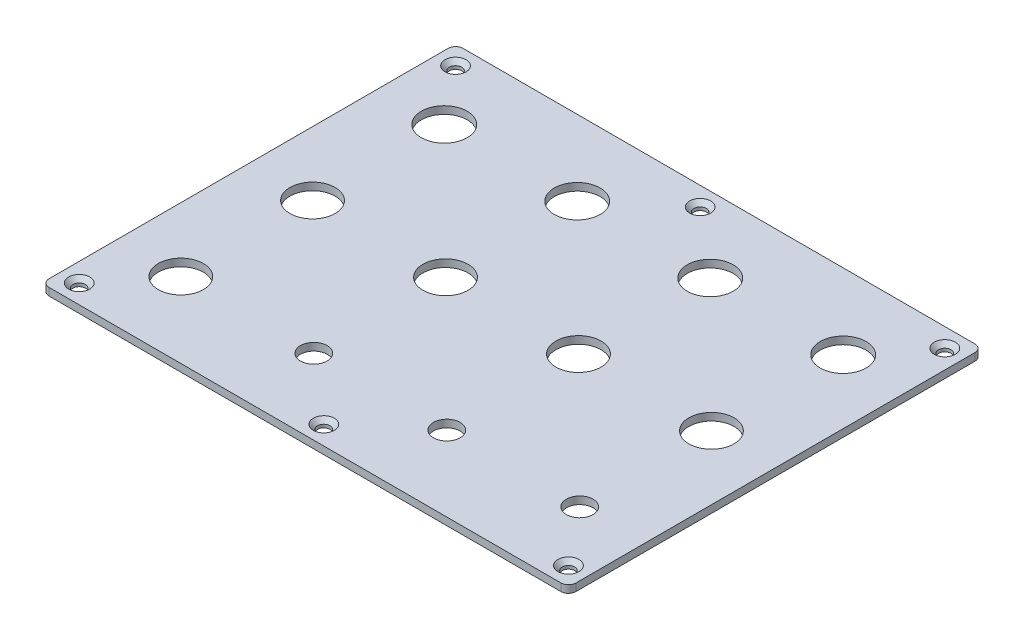
ISO-10303-21;
HEADER;
FILE_DESCRIPTION(('STEP AP214'),'2;1');
FILE_NAME('part.step','',(''),(''),'','','');
FILE_SCHEMA(('AUTOMOTIVE_DESIGN { 1 0 10303 214 1 1 1 1 }'));
ENDSEC;
DATA;
#1=APPLICATION_CONTEXT('core data for automotive mechanical design processes');
#2=APPLICATION_PROTOCOL_DEFINITION('international standard','automotive_design',2000,#1);
#3=PRODUCT_CONTEXT('',#1,'mechanical');
#4=PRODUCT('Part','Part','',(#3));
#5=PRODUCT_RELATED_PRODUCT_CATEGORY('part','',(#4));
#6=PRODUCT_DEFINITION_FORMATION('','',#4);
#7=PRODUCT_DEFINITION_CONTEXT('part definition',#1,'design');
#8=PRODUCT_DEFINITION('design','',#6,#7);
#9=PRODUCT_DEFINITION_SHAPE('','',#8);
#10=(LENGTH_UNIT() NAMED_UNIT(*) SI_UNIT(.MILLI.,.METRE.));
#11=(NAMED_UNIT(*) PLANE_ANGLE_UNIT() SI_UNIT($,.RADIAN.));
#12=(NAMED_UNIT(*) SI_UNIT($,.STERADIAN.) SOLID_ANGLE_UNIT());
#13=UNCERTAINTY_MEASURE_WITH_UNIT(LENGTH_MEASURE(1.E-05),#10,'distance_accuracy_value','');
#14=(GEOMETRIC_REPRESENTATION_CONTEXT(3) GLOBAL_UNCERTAINTY_ASSIGNED_CONTEXT((#13)) GLOBAL_UNIT_ASSIGNED_CONTEXT((#10,
#11,#12)) REPRESENTATION_CONTEXT('',''));
#15=CARTESIAN_POINT('',(0.,0.,0.));
#16=DIRECTION('',(0.,0.,1.));
#17=DIRECTION('',(1.,0.,0.));
#18=AXIS2_PLACEMENT_3D('',#15,#16,#17);
#19=CARTESIAN_POINT('',(-138.,2.,-1.99999999999999));
#20=DIRECTION('',(0.,-1.,0.));
#21=DIRECTION('',(0.,0.,-1.));
#22=AXIS2_PLACEMENT_3D('',#19,#20,#21);
#23=CYLINDRICAL_SURFACE('',#22,2.);
#24=DIRECTION('',(0.,-1.,0.));
#25=VECTOR('',#24,1.);
#26=CARTESIAN_POINT('',(-138.,2.,0.));
#27=LINE('',#26,#25);
#28=CARTESIAN_POINT('',(-138.,2.,0.));
#29=VERTEX_POINT('',#28);
#30=CARTESIAN_POINT('',(-138.,0.,0.));
#31=VERTEX_POINT('',#30);
#32=EDGE_CURVE('E174',#29,#31,#27,.T.);
#33=ORIENTED_EDGE('',*,*,#32,.F.);
#34=CARTESIAN_POINT('',(-138.,2.,-1.99999999999999));
#35=DIRECTION('',(0.,1.,0.));
#36=DIRECTION('',(0.,0.,1.));
#37=AXIS2_PLACEMENT_3D('',#34,#35,#36);
#38=CIRCLE('',#37,2.);
#39=CARTESIAN_POINT('',(-140.,2.,-1.99999999999999));
#40=VERTEX_POINT('',#39);
#41=EDGE_CURVE('E40',#40,#29,#38,.T.);
#42=ORIENTED_EDGE('',*,*,#41,.F.);
#43=DIRECTION('',(0.,-1.,0.));
#44=VECTOR('',#43,1.);
#45=CARTESIAN_POINT('',(-140.,2.,-1.99999999999999));
#46=LINE('',#45,#44);
#47=CARTESIAN_POINT('',(-140.,0.,-1.99999999999999));
#48=VERTEX_POINT('',#47);
#49=EDGE_CURVE('E177',#48,#40,#46,.F.);
#50=ORIENTED_EDGE('',*,*,#49,.F.);
#51=CARTESIAN_POINT('',(-138.,0.,-1.99999999999999));
#52=DIRECTION('',(0.,1.,0.));
#53=DIRECTION('',(0.,0.,1.));
#54=AXIS2_PLACEMENT_3D('',#51,#52,#53);
#55=CIRCLE('',#54,2.);
#56=EDGE_CURVE('E11',#31,#48,#55,.F.);
#57=ORIENTED_EDGE('',*,*,#56,.F.);
#58=EDGE_LOOP('',(#33,#42,#50,#57));
#59=FACE_BOUND('',#58,.T.);
#60=ADVANCED_FACE('F33',(#59),#23,.T.);
#61=CARTESIAN_POINT('',(-2.,2.,-2.));
#62=DIRECTION('',(0.,-1.,0.));
#63=DIRECTION('',(0.,0.,-1.));
#64=AXIS2_PLACEMENT_3D('',#61,#62,#63);
#65=CYLINDRICAL_SURFACE('',#64,2.);
#66=DIRECTION('',(0.,-1.,0.));
#67=VECTOR('',#66,1.);
#68=CARTESIAN_POINT('',(0.,2.,-2.));
#69=LINE('',#68,#67);
#70=CARTESIAN_POINT('',(0.,2.,-2.));
#71=VERTEX_POINT('',#70);
#72=CARTESIAN_POINT('',(0.,0.,-2.));
#73=VERTEX_POINT('',#72);
#74=EDGE_CURVE('E163',#71,#73,#69,.T.);
#75=ORIENTED_EDGE('',*,*,#74,.F.);
#76=CARTESIAN_POINT('',(-2.,2.,-2.));
#77=DIRECTION('',(0.,1.,0.));
#78=DIRECTION('',(0.,0.,1.));
#79=AXIS2_PLACEMENT_3D('',#76,#77,#78);
#80=CIRCLE('',#79,2.);
#81=CARTESIAN_POINT('',(-2.,2.,0.));
#82=VERTEX_POINT('',#81);
#83=EDGE_CURVE('E169',#82,#71,#80,.T.);
#84=ORIENTED_EDGE('',*,*,#83,.F.);
#85=DIRECTION('',(0.,-1.,0.));
#86=VECTOR('',#85,1.);
#87=CARTESIAN_POINT('',(-2.,2.,0.));
#88=LINE('',#87,#86);
#89=CARTESIAN_POINT('',(-2.,0.,0.));
#90=VERTEX_POINT('',#89);
#91=EDGE_CURVE('E166',#90,#82,#88,.F.);
#92=ORIENTED_EDGE('',*,*,#91,.F.);
#93=CARTESIAN_POINT('',(-2.,0.,-2.));
#94=DIRECTION('',(0.,1.,0.));
#95=DIRECTION('',(0.,0.,1.));
#96=AXIS2_PLACEMENT_3D('',#93,#94,#95);
#97=CIRCLE('',#96,2.);
#98=EDGE_CURVE('E171',#73,#90,#97,.F.);
#99=ORIENTED_EDGE('',*,*,#98,.F.);
#100=EDGE_LOOP('',(#75,#84,#92,#99));
#101=FACE_BOUND('',#100,.T.);
#102=ADVANCED_FACE('F216',(#101),#65,.T.);
#103=CARTESIAN_POINT('',(-2.,2.,-108.));
#104=DIRECTION('',(0.,-1.,0.));
#105=DIRECTION('',(0.,0.,-1.));
#106=AXIS2_PLACEMENT_3D('',#103,#104,#105);
#107=CYLINDRICAL_SURFACE('',#106,2.);
#108=DIRECTION('',(0.,-1.,0.));
#109=VECTOR('',#108,1.);
#110=CARTESIAN_POINT('',(-2.,2.,-110.));
#111=LINE('',#110,#109);
#112=CARTESIAN_POINT('',(-2.,2.,-110.));
#113=VERTEX_POINT('',#112);
#114=CARTESIAN_POINT('',(-2.,0.,-110.));
#115=VERTEX_POINT('',#114);
#116=EDGE_CURVE('E105',#113,#115,#111,.T.);
#117=ORIENTED_EDGE('',*,*,#116,.F.);
#118=CARTESIAN_POINT('',(-2.,2.,-108.));
#119=DIRECTION('',(0.,1.,0.));
#120=DIRECTION('',(0.,0.,1.));
#121=AXIS2_PLACEMENT_3D('',#118,#119,#120);
#122=CIRCLE('',#121,2.);
#123=CARTESIAN_POINT('',(0.,2.,-108.));
#124=VERTEX_POINT('',#123);
#125=EDGE_CURVE('E158',#124,#113,#122,.T.);
#126=ORIENTED_EDGE('',*,*,#125,.F.);
#127=DIRECTION('',(0.,-1.,0.));
#128=VECTOR('',#127,1.);
#129=CARTESIAN_POINT('',(0.,2.,-108.));
#130=LINE('',#129,#128);
#131=CARTESIAN_POINT('',(0.,0.,-108.));
#132=VERTEX_POINT('',#131);
#133=EDGE_CURVE('E155',#132,#124,#130,.F.);
#134=ORIENTED_EDGE('',*,*,#133,.F.);
#135=CARTESIAN_POINT('',(-2.,0.,-108.));
#136=DIRECTION('',(0.,1.,0.));
#137=DIRECTION('',(0.,0.,1.));
#138=AXIS2_PLACEMENT_3D('',#135,#136,#137);
#139=CIRCLE('',#138,2.);
#140=EDGE_CURVE('E160',#115,#132,#139,.F.);
#141=ORIENTED_EDGE('',*,*,#140,.F.);
#142=EDGE_LOOP('',(#117,#126,#134,#141));
#143=FACE_BOUND('',#142,.T.);
#144=ADVANCED_FACE('F211',(#143),#107,.T.);
#145=CARTESIAN_POINT('',(-138.,2.,-108.));
#146=DIRECTION('',(0.,-1.,0.));
#147=DIRECTION('',(0.,0.,-1.));
#148=AXIS2_PLACEMENT_3D('',#145,#146,#147);
#149=CYLINDRICAL_SURFACE('',#148,2.);
#150=DIRECTION('',(0.,-1.,0.));
#151=VECTOR('',#150,1.);
#152=CARTESIAN_POINT('',(-140.,2.,-108.));
#153=LINE('',#152,#151);
#154=CARTESIAN_POINT('',(-140.,2.,-108.));
#155=VERTEX_POINT('',#154);
#156=CARTESIAN_POINT('',(-140.,0.,-108.));
#157=VERTEX_POINT('',#156);
#158=EDGE_CURVE('E100',#155,#157,#153,.T.);
#159=ORIENTED_EDGE('',*,*,#158,.F.);
#160=CARTESIAN_POINT('',(-138.,2.,-108.));
#161=DIRECTION('',(0.,1.,0.));
#162=DIRECTION('',(0.,0.,1.));
#163=AXIS2_PLACEMENT_3D('',#160,#161,#162);
#164=CIRCLE('',#163,2.);
#165=CARTESIAN_POINT('',(-138.,2.,-110.));
#166=VERTEX_POINT('',#165);
#167=EDGE_CURVE('E106',#166,#155,#164,.T.);
#168=ORIENTED_EDGE('',*,*,#167,.F.);
#169=DIRECTION('',(0.,-1.,0.));
#170=VECTOR('',#169,1.);
#171=CARTESIAN_POINT('',(-138.,2.,-110.));
#172=LINE('',#171,#170);
#173=CARTESIAN_POINT('',(-138.,0.,-110.));
#174=VERTEX_POINT('',#173);
#175=EDGE_CURVE('E103',#174,#166,#172,.F.);
#176=ORIENTED_EDGE('',*,*,#175,.F.);
#177=CARTESIAN_POINT('',(-138.,0.,-108.));
#178=DIRECTION('',(0.,1.,0.));
#179=DIRECTION('',(0.,0.,1.));
#180=AXIS2_PLACEMENT_3D('',#177,#178,#179);
#181=CIRCLE('',#180,2.);
#182=EDGE_CURVE('E96',#157,#174,#181,.F.);
#183=ORIENTED_EDGE('',*,*,#182,.F.);
#184=EDGE_LOOP('',(#159,#168,#176,#183));
#185=FACE_BOUND('',#184,.T.);
#186=ADVANCED_FACE('F98',(#185),#149,.T.);
#187=CARTESIAN_POINT('',(0.,2.,0.));
#188=DIRECTION('',(-1.,0.,0.));
#189=DIRECTION('',(0.,0.,1.));
#190=AXIS2_PLACEMENT_3D('',#187,#188,#189);
#191=PLANE('',#190);
#192=DIRECTION('',(0.,0.,-1.));
#193=VECTOR('',#192,1.);
#194=CARTESIAN_POINT('',(0.,2.,0.));
#195=LINE('',#194,#193);
#196=EDGE_CURVE('E120',#71,#124,#195,.T.);
#197=ORIENTED_EDGE('',*,*,#196,.F.);
#198=ORIENTED_EDGE('',*,*,#74,.T.);
#199=DIRECTION('',(0.,0.,-1.));
#200=VECTOR('',#199,1.);
#201=CARTESIAN_POINT('',(0.,0.,0.));
#202=LINE('',#201,#200);
#203=EDGE_CURVE('E122',#73,#132,#202,.T.);
#204=ORIENTED_EDGE('',*,*,#203,.T.);
#205=ORIENTED_EDGE('',*,*,#133,.T.);
#206=EDGE_LOOP('',(#197,#198,#204,#205));
#207=FACE_BOUND('',#206,.T.);
#208=ADVANCED_FACE('F213',(#207),#191,.F.);
#209=CARTESIAN_POINT('',(0.,2.,-110.));
#210=DIRECTION('',(0.,0.,1.));
#211=DIRECTION('',(1.,0.,0.));
#212=AXIS2_PLACEMENT_3D('',#209,#210,#211);
#213=PLANE('',#212);
#214=DIRECTION('',(-1.,0.,0.));
#215=VECTOR('',#214,1.);
#216=CARTESIAN_POINT('',(0.,2.,-110.));
#217=LINE('',#216,#215);
#218=EDGE_CURVE('E186',#113,#166,#217,.T.);
#219=ORIENTED_EDGE('',*,*,#218,.F.);
#220=ORIENTED_EDGE('',*,*,#116,.T.);
#221=DIRECTION('',(-1.,0.,0.));
#222=VECTOR('',#221,1.);
#223=CARTESIAN_POINT('',(0.,0.,-110.));
#224=LINE('',#223,#222);
#225=EDGE_CURVE('E118',#115,#174,#224,.T.);
#226=ORIENTED_EDGE('',*,*,#225,.T.);
#227=ORIENTED_EDGE('',*,*,#175,.T.);
#228=EDGE_LOOP('',(#219,#220,#226,#227));
#229=FACE_BOUND('',#228,.T.);
#230=ADVANCED_FACE('F208',(#229),#213,.F.);
#231=CARTESIAN_POINT('',(-140.,2.,0.));
#232=DIRECTION('',(1.,0.,0.));
#233=DIRECTION('',(0.,0.,-1.));
#234=AXIS2_PLACEMENT_3D('',#231,#232,#233);
#235=PLANE('',#234);
#236=DIRECTION('',(0.,0.,1.));
#237=VECTOR('',#236,1.);
#238=CARTESIAN_POINT('',(-140.,0.,0.));
#239=LINE('',#238,#237);
#240=EDGE_CURVE('E111',#157,#48,#239,.T.);
#241=ORIENTED_EDGE('',*,*,#240,.T.);
#242=ORIENTED_EDGE('',*,*,#49,.T.);
#243=DIRECTION('',(0.,0.,1.));
#244=VECTOR('',#243,1.);
#245=CARTESIAN_POINT('',(-140.,2.,0.));
#246=LINE('',#245,#244);
#247=EDGE_CURVE('E113',#155,#40,#246,.T.);
#248=ORIENTED_EDGE('',*,*,#247,.F.);
#249=ORIENTED_EDGE('',*,*,#158,.T.);
#250=EDGE_LOOP('',(#241,#242,#248,#249));
#251=FACE_BOUND('',#250,.T.);
#252=ADVANCED_FACE('F110',(#251),#235,.F.);
#253=CARTESIAN_POINT('',(0.,2.,0.));
#254=DIRECTION('',(0.,0.,-1.));
#255=DIRECTION('',(-1.,0.,0.));
#256=AXIS2_PLACEMENT_3D('',#253,#254,#255);
#257=PLANE('',#256);
#258=DIRECTION('',(1.,0.,0.));
#259=VECTOR('',#258,1.);
#260=CARTESIAN_POINT('',(0.,2.,0.));
#261=LINE('',#260,#259);
#262=EDGE_CURVE('E114',#29,#82,#261,.T.);
#263=ORIENTED_EDGE('',*,*,#262,.F.);
#264=ORIENTED_EDGE('',*,*,#32,.T.);
#265=DIRECTION('',(1.,0.,0.));
#266=VECTOR('',#265,1.);
#267=CARTESIAN_POINT('',(0.,0.,0.));
#268=LINE('',#267,#266);
#269=EDGE_CURVE('E117',#31,#90,#268,.T.);
#270=ORIENTED_EDGE('',*,*,#269,.T.);
#271=ORIENTED_EDGE('',*,*,#91,.T.);
#272=EDGE_LOOP('',(#263,#264,#270,#271));
#273=FACE_BOUND('',#272,.T.);
#274=ADVANCED_FACE('F183',(#273),#257,.F.);
#275=CARTESIAN_POINT('',(0.,2.,0.));
#276=DIRECTION('',(0.,1.,0.));
#277=DIRECTION('',(0.,0.,1.));
#278=AXIS2_PLACEMENT_3D('',#275,#276,#277);
#279=PLANE('',#278);
#280=CARTESIAN_POINT('',(-70.,2.,-5.));
#281=DIRECTION('',(0.,1.,0.));
#282=DIRECTION('',(0.,0.,-1.));
#283=AXIS2_PLACEMENT_3D('',#280,#281,#282);
#284=CIRCLE('',#283,2.79999999999999);
#285=CARTESIAN_POINT('',(-70.,2.,-7.8));
#286=VERTEX_POINT('',#285);
#287=EDGE_CURVE('E149',#286,#286,#284,.T.);
#288=ORIENTED_EDGE('',*,*,#287,.F.);
#289=EDGE_LOOP('',(#288));
#290=FACE_BOUND('',#289,.T.);
#291=CARTESIAN_POINT('',(-70.,2.,-105.));
#292=DIRECTION('',(0.,1.,0.));
#293=DIRECTION('',(0.,0.,1.));
#294=AXIS2_PLACEMENT_3D('',#291,#292,#293);
#295=CIRCLE('',#294,2.79999999999999);
#296=CARTESIAN_POINT('',(-70.,2.,-102.2));
#297=VERTEX_POINT('',#296);
#298=EDGE_CURVE('E146',#297,#297,#295,.T.);
#299=ORIENTED_EDGE('',*,*,#298,.F.);
#300=EDGE_LOOP('',(#299));
#301=FACE_BOUND('',#300,.T.);
#302=CARTESIAN_POINT('',(-135.,2.,-4.99999999999999));
#303=DIRECTION('',(0.,1.,0.));
#304=DIRECTION('',(0.,0.,1.));
#305=AXIS2_PLACEMENT_3D('',#302,#303,#304);
#306=CIRCLE('',#305,2.80000000000001);
#307=CARTESIAN_POINT('',(-135.,2.,-2.19999999999999));
#308=VERTEX_POINT('',#307);
#309=EDGE_CURVE('E142',#308,#308,#306,.T.);
#310=ORIENTED_EDGE('',*,*,#309,.F.);
#311=EDGE_LOOP('',(#310));
#312=FACE_BOUND('',#311,.T.);
#313=CARTESIAN_POINT('',(-5.,2.,-4.99999999999999));
#314=DIRECTION('',(0.,1.,0.));
#315=DIRECTION('',(0.,0.,1.));
#316=AXIS2_PLACEMENT_3D('',#313,#314,#315);
#317=CIRCLE('',#316,2.8);
#318=CARTESIAN_POINT('',(-5.,2.,-2.19999999999999));
#319=VERTEX_POINT('',#318);
#320=EDGE_CURVE('E138',#319,#319,#317,.T.);
#321=ORIENTED_EDGE('',*,*,#320,.F.);
#322=EDGE_LOOP('',(#321));
#323=FACE_BOUND('',#322,.T.);
#324=CARTESIAN_POINT('',(-5.,2.,-105.));
#325=DIRECTION('',(0.,1.,0.));
#326=DIRECTION('',(0.,0.,1.));
#327=AXIS2_PLACEMENT_3D('',#324,#325,#326);
#328=CIRCLE('',#327,2.79999999999999);
#329=CARTESIAN_POINT('',(-5.,2.,-102.2));
#330=VERTEX_POINT('',#329);
#331=EDGE_CURVE('E134',#330,#330,#328,.T.);
#332=ORIENTED_EDGE('',*,*,#331,.F.);
#333=EDGE_LOOP('',(#332));
#334=FACE_BOUND('',#333,.T.);
#335=CARTESIAN_POINT('',(-135.,2.,-105.));
#336=DIRECTION('',(0.,1.,0.));
#337=DIRECTION('',(0.,0.,1.));
#338=AXIS2_PLACEMENT_3D('',#335,#336,#337);
#339=CIRCLE('',#338,2.8);
#340=CARTESIAN_POINT('',(-135.,2.,-102.2));
#341=VERTEX_POINT('',#340);
#342=EDGE_CURVE('E130',#341,#341,#339,.T.);
#343=ORIENTED_EDGE('',*,*,#342,.F.);
#344=EDGE_LOOP('',(#343));
#345=FACE_BOUND('',#344,.T.);
#346=CARTESIAN_POINT('',(-123.,2.,-20.));
#347=DIRECTION('',(0.,1.,0.));
#348=DIRECTION('',(0.,0.,1.));
#349=AXIS2_PLACEMENT_3D('',#346,#347,#348);
#350=CIRCLE('',#349,6.);
#351=CARTESIAN_POINT('',(-123.,2.,-14.));
#352=VERTEX_POINT('',#351);
#353=EDGE_CURVE('E363',#352,#352,#350,.T.);
#354=ORIENTED_EDGE('',*,*,#353,.F.);
#355=EDGE_LOOP('',(#354));
#356=FACE_BOUND('',#355,.T.);
#357=CARTESIAN_POINT('',(-17.,2.,-20.));
#358=DIRECTION('',(0.,1.,0.));
#359=DIRECTION('',(0.,0.,1.));
#360=AXIS2_PLACEMENT_3D('',#357,#358,#359);
#361=CIRCLE('',#360,3.55);
#362=CARTESIAN_POINT('',(-17.,2.,-16.45));
#363=VERTEX_POINT('',#362);
#364=EDGE_CURVE('E367',#363,#363,#361,.T.);
#365=ORIENTED_EDGE('',*,*,#364,.F.);
#366=EDGE_LOOP('',(#365));
#367=FACE_BOUND('',#366,.T.);
#368=CARTESIAN_POINT('',(-52.3333333333333,2.,-20.));
#369=DIRECTION('',(0.,1.,0.));
#370=DIRECTION('',(0.,0.,1.));
#371=AXIS2_PLACEMENT_3D('',#368,#369,#370);
#372=CIRCLE('',#371,3.55);
#373=CARTESIAN_POINT('',(-52.3333333333333,2.,-16.45));
#374=VERTEX_POINT('',#373);
#375=EDGE_CURVE('E373',#374,#374,#372,.T.);
#376=ORIENTED_EDGE('',*,*,#375,.F.);
#377=EDGE_LOOP('',(#376));
#378=FACE_BOUND('',#377,.T.);
#379=CARTESIAN_POINT('',(-87.6666666666667,2.,-20.));
#380=DIRECTION('',(0.,1.,0.));
#381=DIRECTION('',(0.,0.,1.));
#382=AXIS2_PLACEMENT_3D('',#379,#380,#381);
#383=CIRCLE('',#382,3.55);
#384=CARTESIAN_POINT('',(-87.6666666666667,2.,-16.45));
#385=VERTEX_POINT('',#384);
#386=EDGE_CURVE('E379',#385,#385,#383,.T.);
#387=ORIENTED_EDGE('',*,*,#386,.F.);
#388=EDGE_LOOP('',(#387));
#389=FACE_BOUND('',#388,.T.);
#390=CARTESIAN_POINT('',(-17.,2.,-90.));
#391=DIRECTION('',(0.,1.,0.));
#392=DIRECTION('',(0.,0.,1.));
#393=AXIS2_PLACEMENT_3D('',#390,#391,#392);
#394=CIRCLE('',#393,6.09999999999999);
#395=CARTESIAN_POINT('',(-17.,2.,-83.9));
#396=VERTEX_POINT('',#395);
#397=EDGE_CURVE('E385',#396,#396,#394,.T.);
#398=ORIENTED_EDGE('',*,*,#397,.F.);
#399=EDGE_LOOP('',(#398));
#400=FACE_BOUND('',#399,.T.);
#401=CARTESIAN_POINT('',(-52.3333333333333,2.,-90.));
#402=DIRECTION('',(0.,1.,0.));
#403=DIRECTION('',(0.,0.,1.));
#404=AXIS2_PLACEMENT_3D('',#401,#402,#403);
#405=CIRCLE('',#404,6.1);
#406=CARTESIAN_POINT('',(-52.3333333333333,2.,-83.9));
#407=VERTEX_POINT('',#406);
#408=EDGE_CURVE('E391',#407,#407,#405,.T.);
#409=ORIENTED_EDGE('',*,*,#408,.F.);
#410=EDGE_LOOP('',(#409));
#411=FACE_BOUND('',#410,.T.);
#412=CARTESIAN_POINT('',(-87.6666666666667,2.,-90.));
#413=DIRECTION('',(0.,1.,0.));
#414=DIRECTION('',(0.,0.,1.));
#415=AXIS2_PLACEMENT_3D('',#412,#413,#414);
#416=CIRCLE('',#415,6.09999999999999);
#417=CARTESIAN_POINT('',(-87.6666666666667,2.,-83.9));
#418=VERTEX_POINT('',#417);
#419=EDGE_CURVE('E397',#418,#418,#416,.T.);
#420=ORIENTED_EDGE('',*,*,#419,.F.);
#421=EDGE_LOOP('',(#420));
#422=FACE_BOUND('',#421,.T.);
#423=CARTESIAN_POINT('',(-123.,2.,-90.));
#424=DIRECTION('',(0.,1.,0.));
#425=DIRECTION('',(0.,0.,1.));
#426=AXIS2_PLACEMENT_3D('',#423,#424,#425);
#427=CIRCLE('',#426,6.09999999999999);
#428=CARTESIAN_POINT('',(-123.,2.,-83.9));
#429=VERTEX_POINT('',#428);
#430=EDGE_CURVE('E403',#429,#429,#427,.T.);
#431=ORIENTED_EDGE('',*,*,#430,.F.);
#432=EDGE_LOOP('',(#431));
#433=FACE_BOUND('',#432,.T.);
#434=CARTESIAN_POINT('',(-17.,2.,-55.));
#435=DIRECTION('',(0.,1.,0.));
#436=DIRECTION('',(0.,0.,1.));
#437=AXIS2_PLACEMENT_3D('',#434,#435,#436);
#438=CIRCLE('',#437,6.00000000000001);
#439=CARTESIAN_POINT('',(-17.,2.,-49.));
#440=VERTEX_POINT('',#439);
#441=EDGE_CURVE('E409',#440,#440,#438,.T.);
#442=ORIENTED_EDGE('',*,*,#441,.F.);
#443=EDGE_LOOP('',(#442));
#444=FACE_BOUND('',#443,.T.);
#445=CARTESIAN_POINT('',(-52.3333333333333,2.,-55.));
#446=DIRECTION('',(0.,1.,0.));
#447=DIRECTION('',(0.,0.,1.));
#448=AXIS2_PLACEMENT_3D('',#445,#446,#447);
#449=CIRCLE('',#448,6.00000000000001);
#450=CARTESIAN_POINT('',(-52.3333333333333,2.,-49.));
#451=VERTEX_POINT('',#450);
#452=EDGE_CURVE('E415',#451,#451,#449,.T.);
#453=ORIENTED_EDGE('',*,*,#452,.F.);
#454=EDGE_LOOP('',(#453));
#455=FACE_BOUND('',#454,.T.);
#456=CARTESIAN_POINT('',(-87.6666666666667,2.,-55.));
#457=DIRECTION('',(0.,1.,0.));
#458=DIRECTION('',(0.,0.,1.));
#459=AXIS2_PLACEMENT_3D('',#456,#457,#458);
#460=CIRCLE('',#459,6.);
#461=CARTESIAN_POINT('',(-87.6666666666667,2.,-49.));
#462=VERTEX_POINT('',#461);
#463=EDGE_CURVE('E201',#462,#462,#460,.T.);
#464=ORIENTED_EDGE('',*,*,#463,.F.);
#465=EDGE_LOOP('',(#464));
#466=FACE_BOUND('',#465,.T.);
#467=CARTESIAN_POINT('',(-123.,2.,-55.));
#468=DIRECTION('',(0.,1.,0.));
#469=DIRECTION('',(0.,0.,1.));
#470=AXIS2_PLACEMENT_3D('',#467,#468,#469);
#471=CIRCLE('',#470,6.);
#472=CARTESIAN_POINT('',(-123.,2.,-49.));
#473=VERTEX_POINT('',#472);
#474=EDGE_CURVE('E193',#473,#473,#471,.T.);
#475=ORIENTED_EDGE('',*,*,#474,.F.);
#476=EDGE_LOOP('',(#475));
#477=FACE_BOUND('',#476,.T.);
#478=ORIENTED_EDGE('',*,*,#247,.T.);
#479=ORIENTED_EDGE('',*,*,#41,.T.);
#480=ORIENTED_EDGE('',*,*,#262,.T.);
#481=ORIENTED_EDGE('',*,*,#83,.T.);
#482=ORIENTED_EDGE('',*,*,#196,.T.);
#483=ORIENTED_EDGE('',*,*,#125,.T.);
#484=ORIENTED_EDGE('',*,*,#218,.T.);
#485=ORIENTED_EDGE('',*,*,#167,.T.);
#486=EDGE_LOOP('',(#478,#479,#480,#481,#482,#483,#484,#485));
#487=FACE_BOUND('',#486,.T.);
#488=ADVANCED_FACE('F179',(#290,#301,#312,#323,#334,#345,#356,#367,#378,#389,#400,#411,#422,
#433,#444,#455,#466,#477,#487),#279,.T.);
#489=CARTESIAN_POINT('',(0.,0.,0.));
#490=DIRECTION('',(0.,1.,0.));
#491=DIRECTION('',(0.,0.,1.));
#492=AXIS2_PLACEMENT_3D('',#489,#490,#491);
#493=PLANE('',#492);
#494=CARTESIAN_POINT('',(-70.,0.,-5.));
#495=DIRECTION('',(0.,1.,0.));
#496=DIRECTION('',(0.,0.,-1.));
#497=AXIS2_PLACEMENT_3D('',#494,#495,#496);
#498=CIRCLE('',#497,1.65);
#499=CARTESIAN_POINT('',(-70.,0.,-6.65000000000001));
#500=VERTEX_POINT('',#499);
#501=EDGE_CURVE('E129',#500,#500,#498,.T.);
#502=ORIENTED_EDGE('',*,*,#501,.T.);
#503=EDGE_LOOP('',(#502));
#504=FACE_BOUND('',#503,.T.);
#505=CARTESIAN_POINT('',(-70.,0.,-105.));
#506=DIRECTION('',(0.,1.,0.));
#507=DIRECTION('',(0.,0.,1.));
#508=AXIS2_PLACEMENT_3D('',#505,#506,#507);
#509=CIRCLE('',#508,1.65);
#510=CARTESIAN_POINT('',(-70.,0.,-103.35));
#511=VERTEX_POINT('',#510);
#512=EDGE_CURVE('E344',#511,#511,#509,.T.);
#513=ORIENTED_EDGE('',*,*,#512,.T.);
#514=EDGE_LOOP('',(#513));
#515=FACE_BOUND('',#514,.T.);
#516=CARTESIAN_POINT('',(-135.,0.,-4.99999999999999));
#517=DIRECTION('',(0.,1.,0.));
#518=DIRECTION('',(0.,0.,1.));
#519=AXIS2_PLACEMENT_3D('',#516,#517,#518);
#520=CIRCLE('',#519,1.65000000000002);
#521=CARTESIAN_POINT('',(-135.,0.,-3.34999999999997));
#522=VERTEX_POINT('',#521);
#523=EDGE_CURVE('E347',#522,#522,#520,.T.);
#524=ORIENTED_EDGE('',*,*,#523,.T.);
#525=EDGE_LOOP('',(#524));
#526=FACE_BOUND('',#525,.T.);
#527=CARTESIAN_POINT('',(-5.,0.,-4.99999999999999));
#528=DIRECTION('',(0.,1.,0.));
#529=DIRECTION('',(0.,0.,1.));
#530=AXIS2_PLACEMENT_3D('',#527,#528,#529);
#531=CIRCLE('',#530,1.65);
#532=CARTESIAN_POINT('',(-5.,0.,-3.34999999999999));
#533=VERTEX_POINT('',#532);
#534=EDGE_CURVE('E354',#533,#533,#531,.T.);
#535=ORIENTED_EDGE('',*,*,#534,.T.);
#536=EDGE_LOOP('',(#535));
#537=FACE_BOUND('',#536,.T.);
#538=CARTESIAN_POINT('',(-5.,0.,-105.));
#539=DIRECTION('',(0.,1.,0.));
#540=DIRECTION('',(0.,0.,1.));
#541=AXIS2_PLACEMENT_3D('',#538,#539,#540);
#542=CIRCLE('',#541,1.65);
#543=CARTESIAN_POINT('',(-5.,0.,-103.35));
#544=VERTEX_POINT('',#543);
#545=EDGE_CURVE('E357',#544,#544,#542,.T.);
#546=ORIENTED_EDGE('',*,*,#545,.T.);
#547=EDGE_LOOP('',(#546));
#548=FACE_BOUND('',#547,.T.);
#549=CARTESIAN_POINT('',(-135.,0.,-105.));
#550=DIRECTION('',(0.,1.,0.));
#551=DIRECTION('',(0.,0.,1.));
#552=AXIS2_PLACEMENT_3D('',#549,#550,#551);
#553=CIRCLE('',#552,1.65000000000002);
#554=CARTESIAN_POINT('',(-135.,0.,-103.35));
#555=VERTEX_POINT('',#554);
#556=EDGE_CURVE('E360',#555,#555,#553,.T.);
#557=ORIENTED_EDGE('',*,*,#556,.T.);
#558=EDGE_LOOP('',(#557));
#559=FACE_BOUND('',#558,.T.);
#560=CARTESIAN_POINT('',(-123.,0.,-20.));
#561=DIRECTION('',(0.,1.,0.));
#562=DIRECTION('',(0.,0.,1.));
#563=AXIS2_PLACEMENT_3D('',#560,#561,#562);
#564=CIRCLE('',#563,6.);
#565=CARTESIAN_POINT('',(-123.,0.,-14.));
#566=VERTEX_POINT('',#565);
#567=EDGE_CURVE('E364',#566,#566,#564,.T.);
#568=ORIENTED_EDGE('',*,*,#567,.T.);
#569=EDGE_LOOP('',(#568));
#570=FACE_BOUND('',#569,.T.);
#571=CARTESIAN_POINT('',(-17.,0.,-20.));
#572=DIRECTION('',(0.,1.,0.));
#573=DIRECTION('',(0.,0.,1.));
#574=AXIS2_PLACEMENT_3D('',#571,#572,#573);
#575=CIRCLE('',#574,3.55);
#576=CARTESIAN_POINT('',(-17.,0.,-16.45));
#577=VERTEX_POINT('',#576);
#578=EDGE_CURVE('E370',#577,#577,#575,.T.);
#579=ORIENTED_EDGE('',*,*,#578,.T.);
#580=EDGE_LOOP('',(#579));
#581=FACE_BOUND('',#580,.T.);
#582=CARTESIAN_POINT('',(-52.3333333333333,0.,-20.));
#583=DIRECTION('',(0.,1.,0.));
#584=DIRECTION('',(0.,0.,1.));
#585=AXIS2_PLACEMENT_3D('',#582,#583,#584);
#586=CIRCLE('',#585,3.55);
#587=CARTESIAN_POINT('',(-52.3333333333333,0.,-16.45));
#588=VERTEX_POINT('',#587);
#589=EDGE_CURVE('E376',#588,#588,#586,.T.);
#590=ORIENTED_EDGE('',*,*,#589,.T.);
#591=EDGE_LOOP('',(#590));
#592=FACE_BOUND('',#591,.T.);
#593=CARTESIAN_POINT('',(-87.6666666666667,0.,-20.));
#594=DIRECTION('',(0.,1.,0.));
#595=DIRECTION('',(0.,0.,1.));
#596=AXIS2_PLACEMENT_3D('',#593,#594,#595);
#597=CIRCLE('',#596,3.55);
#598=CARTESIAN_POINT('',(-87.6666666666667,0.,-16.45));
#599=VERTEX_POINT('',#598);
#600=EDGE_CURVE('E382',#599,#599,#597,.T.);
#601=ORIENTED_EDGE('',*,*,#600,.T.);
#602=EDGE_LOOP('',(#601));
#603=FACE_BOUND('',#602,.T.);
#604=CARTESIAN_POINT('',(-17.,0.,-90.));
#605=DIRECTION('',(0.,1.,0.));
#606=DIRECTION('',(0.,0.,1.));
#607=AXIS2_PLACEMENT_3D('',#604,#605,#606);
#608=CIRCLE('',#607,6.09999999999999);
#609=CARTESIAN_POINT('',(-17.,0.,-83.9));
#610=VERTEX_POINT('',#609);
#611=EDGE_CURVE('E388',#610,#610,#608,.T.);
#612=ORIENTED_EDGE('',*,*,#611,.T.);
#613=EDGE_LOOP('',(#612));
#614=FACE_BOUND('',#613,.T.);
#615=CARTESIAN_POINT('',(-52.3333333333333,0.,-90.));
#616=DIRECTION('',(0.,1.,0.));
#617=DIRECTION('',(0.,0.,1.));
#618=AXIS2_PLACEMENT_3D('',#615,#616,#617);
#619=CIRCLE('',#618,6.1);
#620=CARTESIAN_POINT('',(-52.3333333333333,0.,-83.9));
#621=VERTEX_POINT('',#620);
#622=EDGE_CURVE('E394',#621,#621,#619,.T.);
#623=ORIENTED_EDGE('',*,*,#622,.T.);
#624=EDGE_LOOP('',(#623));
#625=FACE_BOUND('',#624,.T.);
#626=CARTESIAN_POINT('',(-87.6666666666667,0.,-90.));
#627=DIRECTION('',(0.,1.,0.));
#628=DIRECTION('',(0.,0.,1.));
#629=AXIS2_PLACEMENT_3D('',#626,#627,#628);
#630=CIRCLE('',#629,6.09999999999999);
#631=CARTESIAN_POINT('',(-87.6666666666667,0.,-83.9));
#632=VERTEX_POINT('',#631);
#633=EDGE_CURVE('E400',#632,#632,#630,.T.);
#634=ORIENTED_EDGE('',*,*,#633,.T.);
#635=EDGE_LOOP('',(#634));
#636=FACE_BOUND('',#635,.T.);
#637=CARTESIAN_POINT('',(-123.,0.,-90.));
#638=DIRECTION('',(0.,1.,0.));
#639=DIRECTION('',(0.,0.,1.));
#640=AXIS2_PLACEMENT_3D('',#637,#638,#639);
#641=CIRCLE('',#640,6.09999999999999);
#642=CARTESIAN_POINT('',(-123.,0.,-83.9));
#643=VERTEX_POINT('',#642);
#644=EDGE_CURVE('E406',#643,#643,#641,.T.);
#645=ORIENTED_EDGE('',*,*,#644,.T.);
#646=EDGE_LOOP('',(#645));
#647=FACE_BOUND('',#646,.T.);
#648=CARTESIAN_POINT('',(-17.,0.,-55.));
#649=DIRECTION('',(0.,1.,0.));
#650=DIRECTION('',(0.,0.,1.));
#651=AXIS2_PLACEMENT_3D('',#648,#649,#650);
#652=CIRCLE('',#651,6.00000000000001);
#653=CARTESIAN_POINT('',(-17.,0.,-49.));
#654=VERTEX_POINT('',#653);
#655=EDGE_CURVE('E412',#654,#654,#652,.T.);
#656=ORIENTED_EDGE('',*,*,#655,.T.);
#657=EDGE_LOOP('',(#656));
#658=FACE_BOUND('',#657,.T.);
#659=CARTESIAN_POINT('',(-52.3333333333333,0.,-55.));
#660=DIRECTION('',(0.,1.,0.));
#661=DIRECTION('',(0.,0.,1.));
#662=AXIS2_PLACEMENT_3D('',#659,#660,#661);
#663=CIRCLE('',#662,6.00000000000001);
#664=CARTESIAN_POINT('',(-52.3333333333333,0.,-49.));
#665=VERTEX_POINT('',#664);
#666=EDGE_CURVE('E418',#665,#665,#663,.T.);
#667=ORIENTED_EDGE('',*,*,#666,.T.);
#668=EDGE_LOOP('',(#667));
#669=FACE_BOUND('',#668,.T.);
#670=CARTESIAN_POINT('',(-87.6666666666667,0.,-55.));
#671=DIRECTION('',(0.,1.,0.));
#672=DIRECTION('',(0.,0.,1.));
#673=AXIS2_PLACEMENT_3D('',#670,#671,#672);
#674=CIRCLE('',#673,6.);
#675=CARTESIAN_POINT('',(-87.6666666666667,0.,-49.));
#676=VERTEX_POINT('',#675);
#677=EDGE_CURVE('E198',#676,#676,#674,.T.);
#678=ORIENTED_EDGE('',*,*,#677,.T.);
#679=EDGE_LOOP('',(#678));
#680=FACE_BOUND('',#679,.T.);
#681=CARTESIAN_POINT('',(-123.,0.,-55.));
#682=DIRECTION('',(0.,1.,0.));
#683=DIRECTION('',(0.,0.,1.));
#684=AXIS2_PLACEMENT_3D('',#681,#682,#683);
#685=CIRCLE('',#684,6.);
#686=CARTESIAN_POINT('',(-123.,0.,-49.));
#687=VERTEX_POINT('',#686);
#688=EDGE_CURVE('E189',#687,#687,#685,.T.);
#689=ORIENTED_EDGE('',*,*,#688,.T.);
#690=EDGE_LOOP('',(#689));
#691=FACE_BOUND('',#690,.T.);
#692=ORIENTED_EDGE('',*,*,#269,.F.);
#693=ORIENTED_EDGE('',*,*,#56,.T.);
#694=ORIENTED_EDGE('',*,*,#240,.F.);
#695=ORIENTED_EDGE('',*,*,#182,.T.);
#696=ORIENTED_EDGE('',*,*,#225,.F.);
#697=ORIENTED_EDGE('',*,*,#140,.T.);
#698=ORIENTED_EDGE('',*,*,#203,.F.);
#699=ORIENTED_EDGE('',*,*,#98,.T.);
#700=EDGE_LOOP('',(#692,#693,#694,#695,#696,#697,#698,#699));
#701=FACE_BOUND('',#700,.T.);
#702=ADVANCED_FACE('F116',(#504,#515,#526,#537,#548,#559,#570,#581,#592,#603,#614,#625,#636,
#647,#658,#669,#680,#691,#701),#493,.F.);
#703=CARTESIAN_POINT('',(-123.,0.,-55.));
#704=DIRECTION('',(0.,1.,0.));
#705=DIRECTION('',(0.,0.,1.));
#706=AXIS2_PLACEMENT_3D('',#703,#704,#705);
#707=CYLINDRICAL_SURFACE('',#706,6.);
#708=ORIENTED_EDGE('',*,*,#688,.F.);
#709=EDGE_LOOP('',(#708));
#710=FACE_BOUND('',#709,.T.);
#711=ORIENTED_EDGE('',*,*,#474,.T.);
#712=EDGE_LOOP('',(#711));
#713=FACE_BOUND('',#712,.T.);
#714=ADVANCED_FACE('F236',(#710,#713),#707,.F.);
#715=CARTESIAN_POINT('',(-87.6666666666667,0.,-55.));
#716=DIRECTION('',(0.,1.,0.));
#717=DIRECTION('',(0.,0.,1.));
#718=AXIS2_PLACEMENT_3D('',#715,#716,#717);
#719=CYLINDRICAL_SURFACE('',#718,6.);
#720=ORIENTED_EDGE('',*,*,#677,.F.);
#721=EDGE_LOOP('',(#720));
#722=FACE_BOUND('',#721,.T.);
#723=ORIENTED_EDGE('',*,*,#463,.T.);
#724=EDGE_LOOP('',(#723));
#725=FACE_BOUND('',#724,.T.);
#726=ADVANCED_FACE('F243',(#722,#725),#719,.F.);
#727=CARTESIAN_POINT('',(-52.3333333333333,0.,-55.));
#728=DIRECTION('',(0.,1.,0.));
#729=DIRECTION('',(0.,0.,1.));
#730=AXIS2_PLACEMENT_3D('',#727,#728,#729);
#731=CYLINDRICAL_SURFACE('',#730,6.00000000000001);
#732=ORIENTED_EDGE('',*,*,#666,.F.);
#733=EDGE_LOOP('',(#732));
#734=FACE_BOUND('',#733,.T.);
#735=ORIENTED_EDGE('',*,*,#452,.T.);
#736=EDGE_LOOP('',(#735));
#737=FACE_BOUND('',#736,.T.);
#738=ADVANCED_FACE('F247',(#734,#737),#731,.F.);
#739=CARTESIAN_POINT('',(-17.,0.,-55.));
#740=DIRECTION('',(0.,1.,0.));
#741=DIRECTION('',(0.,0.,1.));
#742=AXIS2_PLACEMENT_3D('',#739,#740,#741);
#743=CYLINDRICAL_SURFACE('',#742,6.00000000000001);
#744=ORIENTED_EDGE('',*,*,#655,.F.);
#745=EDGE_LOOP('',(#744));
#746=FACE_BOUND('',#745,.T.);
#747=ORIENTED_EDGE('',*,*,#441,.T.);
#748=EDGE_LOOP('',(#747));
#749=FACE_BOUND('',#748,.T.);
#750=ADVANCED_FACE('F251',(#746,#749),#743,.F.);
#751=CARTESIAN_POINT('',(-123.,0.,-90.));
#752=DIRECTION('',(0.,1.,0.));
#753=DIRECTION('',(0.,0.,1.));
#754=AXIS2_PLACEMENT_3D('',#751,#752,#753);
#755=CYLINDRICAL_SURFACE('',#754,6.09999999999999);
#756=ORIENTED_EDGE('',*,*,#644,.F.);
#757=EDGE_LOOP('',(#756));
#758=FACE_BOUND('',#757,.T.);
#759=ORIENTED_EDGE('',*,*,#430,.T.);
#760=EDGE_LOOP('',(#759));
#761=FACE_BOUND('',#760,.T.);
#762=ADVANCED_FACE('F255',(#758,#761),#755,.F.);
#763=CARTESIAN_POINT('',(-87.6666666666667,0.,-90.));
#764=DIRECTION('',(0.,1.,0.));
#765=DIRECTION('',(0.,0.,1.));
#766=AXIS2_PLACEMENT_3D('',#763,#764,#765);
#767=CYLINDRICAL_SURFACE('',#766,6.09999999999999);
#768=ORIENTED_EDGE('',*,*,#633,.F.);
#769=EDGE_LOOP('',(#768));
#770=FACE_BOUND('',#769,.T.);
#771=ORIENTED_EDGE('',*,*,#419,.T.);
#772=EDGE_LOOP('',(#771));
#773=FACE_BOUND('',#772,.T.);
#774=ADVANCED_FACE('F259',(#770,#773),#767,.F.);
#775=CARTESIAN_POINT('',(-52.3333333333333,0.,-90.));
#776=DIRECTION('',(0.,1.,0.));
#777=DIRECTION('',(0.,0.,1.));
#778=AXIS2_PLACEMENT_3D('',#775,#776,#777);
#779=CYLINDRICAL_SURFACE('',#778,6.1);
#780=ORIENTED_EDGE('',*,*,#622,.F.);
#781=EDGE_LOOP('',(#780));
#782=FACE_BOUND('',#781,.T.);
#783=ORIENTED_EDGE('',*,*,#408,.T.);
#784=EDGE_LOOP('',(#783));
#785=FACE_BOUND('',#784,.T.);
#786=ADVANCED_FACE('F263',(#782,#785),#779,.F.);
#787=CARTESIAN_POINT('',(-17.,0.,-90.));
#788=DIRECTION('',(0.,1.,0.));
#789=DIRECTION('',(0.,0.,1.));
#790=AXIS2_PLACEMENT_3D('',#787,#788,#789);
#791=CYLINDRICAL_SURFACE('',#790,6.09999999999999);
#792=ORIENTED_EDGE('',*,*,#611,.F.);
#793=EDGE_LOOP('',(#792));
#794=FACE_BOUND('',#793,.T.);
#795=ORIENTED_EDGE('',*,*,#397,.T.);
#796=EDGE_LOOP('',(#795));
#797=FACE_BOUND('',#796,.T.);
#798=ADVANCED_FACE('F267',(#794,#797),#791,.F.);
#799=CARTESIAN_POINT('',(-87.6666666666667,0.,-20.));
#800=DIRECTION('',(0.,1.,0.));
#801=DIRECTION('',(0.,0.,1.));
#802=AXIS2_PLACEMENT_3D('',#799,#800,#801);
#803=CYLINDRICAL_SURFACE('',#802,3.55);
#804=ORIENTED_EDGE('',*,*,#600,.F.);
#805=EDGE_LOOP('',(#804));
#806=FACE_BOUND('',#805,.T.);
#807=ORIENTED_EDGE('',*,*,#386,.T.);
#808=EDGE_LOOP('',(#807));
#809=FACE_BOUND('',#808,.T.);
#810=ADVANCED_FACE('F271',(#806,#809),#803,.F.);
#811=CARTESIAN_POINT('',(-52.3333333333333,0.,-20.));
#812=DIRECTION('',(0.,1.,0.));
#813=DIRECTION('',(0.,0.,1.));
#814=AXIS2_PLACEMENT_3D('',#811,#812,#813);
#815=CYLINDRICAL_SURFACE('',#814,3.55);
#816=ORIENTED_EDGE('',*,*,#589,.F.);
#817=EDGE_LOOP('',(#816));
#818=FACE_BOUND('',#817,.T.);
#819=ORIENTED_EDGE('',*,*,#375,.T.);
#820=EDGE_LOOP('',(#819));
#821=FACE_BOUND('',#820,.T.);
#822=ADVANCED_FACE('F275',(#818,#821),#815,.F.);
#823=CARTESIAN_POINT('',(-17.,0.,-20.));
#824=DIRECTION('',(0.,1.,0.));
#825=DIRECTION('',(0.,0.,1.));
#826=AXIS2_PLACEMENT_3D('',#823,#824,#825);
#827=CYLINDRICAL_SURFACE('',#826,3.55);
#828=ORIENTED_EDGE('',*,*,#578,.F.);
#829=EDGE_LOOP('',(#828));
#830=FACE_BOUND('',#829,.T.);
#831=ORIENTED_EDGE('',*,*,#364,.T.);
#832=EDGE_LOOP('',(#831));
#833=FACE_BOUND('',#832,.T.);
#834=ADVANCED_FACE('F279',(#830,#833),#827,.F.);
#835=CARTESIAN_POINT('',(-123.,0.,-20.));
#836=DIRECTION('',(0.,1.,0.));
#837=DIRECTION('',(0.,0.,1.));
#838=AXIS2_PLACEMENT_3D('',#835,#836,#837);
#839=CYLINDRICAL_SURFACE('',#838,6.);
#840=ORIENTED_EDGE('',*,*,#567,.F.);
#841=EDGE_LOOP('',(#840));
#842=FACE_BOUND('',#841,.T.);
#843=ORIENTED_EDGE('',*,*,#353,.T.);
#844=EDGE_LOOP('',(#843));
#845=FACE_BOUND('',#844,.T.);
#846=ADVANCED_FACE('F283',(#842,#845),#839,.F.);
#847=CARTESIAN_POINT('',(-135.,0.,-105.));
#848=DIRECTION('',(0.,1.,0.));
#849=DIRECTION('',(0.,0.,1.));
#850=AXIS2_PLACEMENT_3D('',#847,#848,#849);
#851=CYLINDRICAL_SURFACE('',#850,1.65000000000002);
#852=CARTESIAN_POINT('',(-135.,0.850000000000015,-105.));
#853=DIRECTION('',(0.,1.,0.));
#854=DIRECTION('',(0.,0.,1.));
#855=AXIS2_PLACEMENT_3D('',#852,#853,#854);
#856=CIRCLE('',#855,1.65000000000002);
#857=CARTESIAN_POINT('',(-135.,0.850000000000015,-103.35));
#858=VERTEX_POINT('',#857);
#859=EDGE_CURVE('E126',#858,#858,#856,.T.);
#860=ORIENTED_EDGE('',*,*,#859,.T.);
#861=EDGE_LOOP('',(#860));
#862=FACE_BOUND('',#861,.T.);
#863=ORIENTED_EDGE('',*,*,#556,.F.);
#864=EDGE_LOOP('',(#863));
#865=FACE_BOUND('',#864,.T.);
#866=ADVANCED_FACE('F287',(#862,#865),#851,.F.);
#867=CARTESIAN_POINT('',(-5.,0.,-105.));
#868=DIRECTION('',(0.,1.,0.));
#869=DIRECTION('',(0.,0.,1.));
#870=AXIS2_PLACEMENT_3D('',#867,#868,#869);
#871=CYLINDRICAL_SURFACE('',#870,1.65);
#872=CARTESIAN_POINT('',(-5.,0.850000000000009,-105.));
#873=DIRECTION('',(0.,1.,0.));
#874=DIRECTION('',(0.,0.,1.));
#875=AXIS2_PLACEMENT_3D('',#872,#873,#874);
#876=CIRCLE('',#875,1.65);
#877=CARTESIAN_POINT('',(-5.,0.850000000000009,-103.35));
#878=VERTEX_POINT('',#877);
#879=EDGE_CURVE('E131',#878,#878,#876,.T.);
#880=ORIENTED_EDGE('',*,*,#879,.T.);
#881=EDGE_LOOP('',(#880));
#882=FACE_BOUND('',#881,.T.);
#883=ORIENTED_EDGE('',*,*,#545,.F.);
#884=EDGE_LOOP('',(#883));
#885=FACE_BOUND('',#884,.T.);
#886=ADVANCED_FACE('F291',(#882,#885),#871,.F.);
#887=CARTESIAN_POINT('',(-5.,0.,-4.99999999999999));
#888=DIRECTION('',(0.,1.,0.));
#889=DIRECTION('',(0.,0.,1.));
#890=AXIS2_PLACEMENT_3D('',#887,#888,#889);
#891=CYLINDRICAL_SURFACE('',#890,1.65);
#892=CARTESIAN_POINT('',(-5.,0.850000000000004,-4.99999999999999));
#893=DIRECTION('',(0.,1.,0.));
#894=DIRECTION('',(0.,0.,1.));
#895=AXIS2_PLACEMENT_3D('',#892,#893,#894);
#896=CIRCLE('',#895,1.65);
#897=CARTESIAN_POINT('',(-5.,0.850000000000004,-3.34999999999999));
#898=VERTEX_POINT('',#897);
#899=EDGE_CURVE('E135',#898,#898,#896,.T.);
#900=ORIENTED_EDGE('',*,*,#899,.T.);
#901=EDGE_LOOP('',(#900));
#902=FACE_BOUND('',#901,.T.);
#903=ORIENTED_EDGE('',*,*,#534,.F.);
#904=EDGE_LOOP('',(#903));
#905=FACE_BOUND('',#904,.T.);
#906=ADVANCED_FACE('F295',(#902,#905),#891,.F.);
#907=CARTESIAN_POINT('',(-135.,0.,-4.99999999999999));
#908=DIRECTION('',(0.,1.,0.));
#909=DIRECTION('',(0.,0.,1.));
#910=AXIS2_PLACEMENT_3D('',#907,#908,#909);
#911=CYLINDRICAL_SURFACE('',#910,1.65000000000002);
#912=CARTESIAN_POINT('',(-135.,0.850000000000015,-4.99999999999999));
#913=DIRECTION('',(0.,1.,0.));
#914=DIRECTION('',(0.,0.,1.));
#915=AXIS2_PLACEMENT_3D('',#912,#913,#914);
#916=CIRCLE('',#915,1.65000000000002);
#917=CARTESIAN_POINT('',(-135.,0.850000000000015,-3.34999999999997));
#918=VERTEX_POINT('',#917);
#919=EDGE_CURVE('E139',#918,#918,#916,.T.);
#920=ORIENTED_EDGE('',*,*,#919,.T.);
#921=EDGE_LOOP('',(#920));
#922=FACE_BOUND('',#921,.T.);
#923=ORIENTED_EDGE('',*,*,#523,.F.);
#924=EDGE_LOOP('',(#923));
#925=FACE_BOUND('',#924,.T.);
#926=ADVANCED_FACE('F299',(#922,#925),#911,.F.);
#927=CARTESIAN_POINT('',(-70.,0.,-105.));
#928=DIRECTION('',(0.,1.,0.));
#929=DIRECTION('',(0.,0.,1.));
#930=AXIS2_PLACEMENT_3D('',#927,#928,#929);
#931=CYLINDRICAL_SURFACE('',#930,1.65);
#932=CARTESIAN_POINT('',(-70.,0.850000000000015,-105.));
#933=DIRECTION('',(0.,1.,0.));
#934=DIRECTION('',(0.,0.,1.));
#935=AXIS2_PLACEMENT_3D('',#932,#933,#934);
#936=CIRCLE('',#935,1.65);
#937=CARTESIAN_POINT('',(-70.,0.850000000000015,-103.35));
#938=VERTEX_POINT('',#937);
#939=EDGE_CURVE('E143',#938,#938,#936,.T.);
#940=ORIENTED_EDGE('',*,*,#939,.T.);
#941=EDGE_LOOP('',(#940));
#942=FACE_BOUND('',#941,.T.);
#943=ORIENTED_EDGE('',*,*,#512,.F.);
#944=EDGE_LOOP('',(#943));
#945=FACE_BOUND('',#944,.T.);
#946=ADVANCED_FACE('F303',(#942,#945),#931,.F.);
#947=CARTESIAN_POINT('',(-70.,0.,-5.));
#948=DIRECTION('',(0.,1.,0.));
#949=DIRECTION('',(0.,0.,1.));
#950=AXIS2_PLACEMENT_3D('',#947,#948,#949);
#951=CYLINDRICAL_SURFACE('',#950,1.65);
#952=CARTESIAN_POINT('',(-70.,0.850000000000014,-5.));
#953=DIRECTION('',(0.,1.,0.));
#954=DIRECTION('',(0.,0.,1.));
#955=AXIS2_PLACEMENT_3D('',#952,#953,#954);
#956=CIRCLE('',#955,1.65);
#957=CARTESIAN_POINT('',(-70.,0.850000000000014,-3.35));
#958=VERTEX_POINT('',#957);
#959=EDGE_CURVE('E147',#958,#958,#956,.T.);
#960=ORIENTED_EDGE('',*,*,#959,.T.);
#961=EDGE_LOOP('',(#960));
#962=FACE_BOUND('',#961,.T.);
#963=ORIENTED_EDGE('',*,*,#501,.F.);
#964=EDGE_LOOP('',(#963));
#965=FACE_BOUND('',#964,.T.);
#966=ADVANCED_FACE('F307',(#962,#965),#951,.F.);
#967=CARTESIAN_POINT('',(-135.,2.,-105.));
#968=DIRECTION('',(0.,1.,0.));
#969=DIRECTION('',(0.,0.,1.));
#970=AXIS2_PLACEMENT_3D('',#967,#968,#969);
#971=CONICAL_SURFACE('',#970,2.8,0.78539816339745);
#972=ORIENTED_EDGE('',*,*,#342,.T.);
#973=EDGE_LOOP('',(#972));
#974=FACE_BOUND('',#973,.T.);
#975=ORIENTED_EDGE('',*,*,#859,.F.);
#976=EDGE_LOOP('',(#975));
#977=FACE_BOUND('',#976,.T.);
#978=ADVANCED_FACE('F311',(#974,#977),#971,.F.);
#979=CARTESIAN_POINT('',(-5.,2.,-105.));
#980=DIRECTION('',(0.,1.,0.));
#981=DIRECTION('',(0.,0.,1.));
#982=AXIS2_PLACEMENT_3D('',#979,#980,#981);
#983=CONICAL_SURFACE('',#982,2.79999999999999,0.78539816339745);
#984=ORIENTED_EDGE('',*,*,#331,.T.);
#985=EDGE_LOOP('',(#984));
#986=FACE_BOUND('',#985,.T.);
#987=ORIENTED_EDGE('',*,*,#879,.F.);
#988=EDGE_LOOP('',(#987));
#989=FACE_BOUND('',#988,.T.);
#990=ADVANCED_FACE('F315',(#986,#989),#983,.F.);
#991=CARTESIAN_POINT('',(-5.,2.,-4.99999999999999));
#992=DIRECTION('',(0.,1.,0.));
#993=DIRECTION('',(0.,0.,1.));
#994=AXIS2_PLACEMENT_3D('',#991,#992,#993);
#995=CONICAL_SURFACE('',#994,2.8,0.78539816339745);
#996=ORIENTED_EDGE('',*,*,#320,.T.);
#997=EDGE_LOOP('',(#996));
#998=FACE_BOUND('',#997,.T.);
#999=ORIENTED_EDGE('',*,*,#899,.F.);
#1000=EDGE_LOOP('',(#999));
#1001=FACE_BOUND('',#1000,.T.);
#1002=ADVANCED_FACE('F319',(#998,#1001),#995,.F.);
#1003=CARTESIAN_POINT('',(-135.,2.,-4.99999999999999));
#1004=DIRECTION('',(0.,1.,0.));
#1005=DIRECTION('',(0.,0.,1.));
#1006=AXIS2_PLACEMENT_3D('',#1003,#1004,#1005);
#1007=CONICAL_SURFACE('',#1006,2.80000000000001,0.78539816339745);
#1008=ORIENTED_EDGE('',*,*,#309,.T.);
#1009=EDGE_LOOP('',(#1008));
#1010=FACE_BOUND('',#1009,.T.);
#1011=ORIENTED_EDGE('',*,*,#919,.F.);
#1012=EDGE_LOOP('',(#1011));
#1013=FACE_BOUND('',#1012,.T.);
#1014=ADVANCED_FACE('F323',(#1010,#1013),#1007,.F.);
#1015=CARTESIAN_POINT('',(-70.,2.,-105.));
#1016=DIRECTION('',(0.,1.,0.));
#1017=DIRECTION('',(0.,0.,1.));
#1018=AXIS2_PLACEMENT_3D('',#1015,#1016,#1017);
#1019=CONICAL_SURFACE('',#1018,2.79999999999999,0.78539816339745);
#1020=ORIENTED_EDGE('',*,*,#298,.T.);
#1021=EDGE_LOOP('',(#1020));
#1022=FACE_BOUND('',#1021,.T.);
#1023=ORIENTED_EDGE('',*,*,#939,.F.);
#1024=EDGE_LOOP('',(#1023));
#1025=FACE_BOUND('',#1024,.T.);
#1026=ADVANCED_FACE('F327',(#1022,#1025),#1019,.F.);
#1027=CARTESIAN_POINT('',(-70.,2.,-5.));
#1028=DIRECTION('',(0.,1.,0.));
#1029=DIRECTION('',(0.,0.,-1.));
#1030=AXIS2_PLACEMENT_3D('',#1027,#1028,#1029);
#1031=CONICAL_SURFACE('',#1030,2.79999999999999,0.78539816339745);
#1032=ORIENTED_EDGE('',*,*,#287,.T.);
#1033=EDGE_LOOP('',(#1032));
#1034=FACE_BOUND('',#1033,.T.);
#1035=ORIENTED_EDGE('',*,*,#959,.F.);
#1036=EDGE_LOOP('',(#1035));
#1037=FACE_BOUND('',#1036,.T.);
#1038=ADVANCED_FACE('F331',(#1034,#1037),#1031,.F.);
#1039=CLOSED_SHELL('',(#60,#102,#144,#186,#208,#230,#252,#274,#488,#702,#714,#726,#738,#750,
#762,#774,#786,#798,#810,#822,#834,#846,#866,#886,#906,#926,#946,#966,#978,#990,#1002,#1014,
#1026,#1038));
#1040=MANIFOLD_SOLID_BREP('B2',#1039);
#1041=ADVANCED_BREP_SHAPE_REPRESENTATION('',(#18,#1040),#14);
#1042=SHAPE_DEFINITION_REPRESENTATION(#9,#1041);
ENDSEC;
END-ISO-10303-21;
